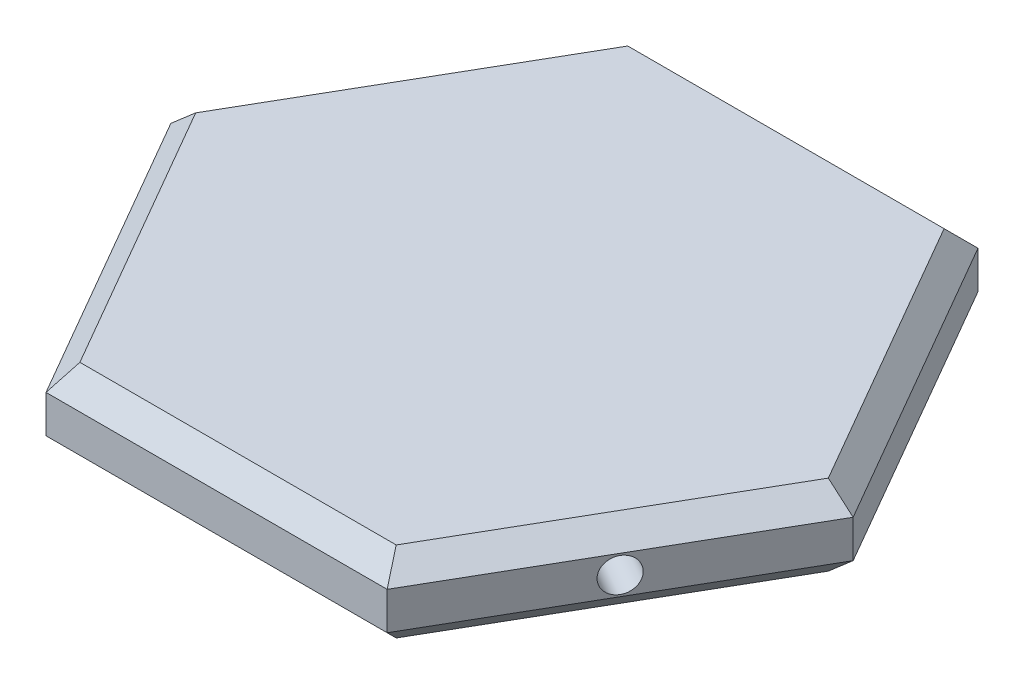
ISO-10303-21;
HEADER;
FILE_DESCRIPTION(('STEP AP214'),'2;1');
FILE_NAME('part.step','',(''),(''),'','','');
FILE_SCHEMA(('AUTOMOTIVE_DESIGN { 1 0 10303 214 1 1 1 1 }'));
ENDSEC;
DATA;
#1=APPLICATION_CONTEXT('core data for automotive mechanical design processes');
#2=APPLICATION_PROTOCOL_DEFINITION('international standard','automotive_design',2000,#1);
#3=PRODUCT_CONTEXT('',#1,'mechanical');
#4=PRODUCT('Part','Part','',(#3));
#5=PRODUCT_RELATED_PRODUCT_CATEGORY('part','',(#4));
#6=PRODUCT_DEFINITION_FORMATION('','',#4);
#7=PRODUCT_DEFINITION_CONTEXT('part definition',#1,'design');
#8=PRODUCT_DEFINITION('design','',#6,#7);
#9=PRODUCT_DEFINITION_SHAPE('','',#8);
#10=(LENGTH_UNIT() NAMED_UNIT(*) SI_UNIT(.MILLI.,.METRE.));
#11=(NAMED_UNIT(*) PLANE_ANGLE_UNIT() SI_UNIT($,.RADIAN.));
#12=(NAMED_UNIT(*) SI_UNIT($,.STERADIAN.) SOLID_ANGLE_UNIT());
#13=UNCERTAINTY_MEASURE_WITH_UNIT(LENGTH_MEASURE(1.E-05),#10,'distance_accuracy_value','');
#14=(GEOMETRIC_REPRESENTATION_CONTEXT(3) GLOBAL_UNCERTAINTY_ASSIGNED_CONTEXT((#13)) GLOBAL_UNIT_ASSIGNED_CONTEXT((#10,
#11,#12)) REPRESENTATION_CONTEXT('',''));
#15=CARTESIAN_POINT('',(0.,0.,0.));
#16=DIRECTION('',(0.,0.,1.));
#17=DIRECTION('',(1.,0.,0.));
#18=AXIS2_PLACEMENT_3D('',#15,#16,#17);
#19=CARTESIAN_POINT('',(-40.3279163028954,19.05,69.85));
#20=DIRECTION('',(0.,0.,-1.));
#21=DIRECTION('',(-1.,0.,0.));
#22=AXIS2_PLACEMENT_3D('',#19,#20,#21);
#23=PLANE('',#22);
#24=DIRECTION('',(0.,-1.,0.));
#25=VECTOR('',#24,1.);
#26=CARTESIAN_POINT('',(-40.3279163028954,19.05,69.85));
#27=LINE('',#26,#25);
#28=CARTESIAN_POINT('',(-40.3279163028954,13.97,69.85));
#29=VERTEX_POINT('',#28);
#30=CARTESIAN_POINT('',(-40.3279163028954,5.08000000000003,69.85));
#31=VERTEX_POINT('',#30);
#32=EDGE_CURVE('E147',#29,#31,#27,.T.);
#33=ORIENTED_EDGE('',*,*,#32,.T.);
#34=DIRECTION('',(1.,0.,0.));
#35=VECTOR('',#34,1.);
#36=CARTESIAN_POINT('',(-40.3279163028954,5.08000000000003,69.85));
#37=LINE('',#36,#35);
#38=CARTESIAN_POINT('',(40.3279163028954,5.08000000000003,69.85));
#39=VERTEX_POINT('',#38);
#40=EDGE_CURVE('E155',#31,#39,#37,.T.);
#41=ORIENTED_EDGE('',*,*,#40,.T.);
#42=DIRECTION('',(0.,-1.,0.));
#43=VECTOR('',#42,1.);
#44=CARTESIAN_POINT('',(40.3279163028954,19.05,69.85));
#45=LINE('',#44,#43);
#46=CARTESIAN_POINT('',(40.3279163028954,13.97,69.85));
#47=VERTEX_POINT('',#46);
#48=EDGE_CURVE('E149',#47,#39,#45,.T.);
#49=ORIENTED_EDGE('',*,*,#48,.F.);
#50=DIRECTION('',(-1.,0.,0.));
#51=VECTOR('',#50,1.);
#52=CARTESIAN_POINT('',(-40.3279163028954,13.97,69.85));
#53=LINE('',#52,#51);
#54=EDGE_CURVE('E145',#47,#29,#53,.T.);
#55=ORIENTED_EDGE('',*,*,#54,.T.);
#56=EDGE_LOOP('',(#33,#41,#49,#55));
#57=FACE_BOUND('',#56,.T.);
#58=ADVANCED_FACE('F53',(#57),#23,.F.);
#59=CARTESIAN_POINT('',(40.3279163028954,19.05,69.85));
#60=DIRECTION('',(-0.866025403784439,0.,-0.5));
#61=DIRECTION('',(-0.5,0.,0.866025403784439));
#62=AXIS2_PLACEMENT_3D('',#59,#60,#61);
#63=PLANE('',#62);
#64=CARTESIAN_POINT('',(60.4918744543432,9.52499999999996,34.9249999999997));
#65=DIRECTION('',(0.866025403784441,0.,0.499999999999996));
#66=DIRECTION('',(0.499999999999996,0.,-0.866025403784441));
#67=AXIS2_PLACEMENT_3D('',#64,#65,#66);
#68=CIRCLE('',#67,4.);
#69=CARTESIAN_POINT('',(62.4918744543432,9.52499999999996,31.460898384862));
#70=VERTEX_POINT('',#69);
#71=EDGE_CURVE('E697',#70,#70,#68,.T.);
#72=ORIENTED_EDGE('',*,*,#71,.F.);
#73=EDGE_LOOP('',(#72));
#74=FACE_BOUND('',#73,.T.);
#75=ORIENTED_EDGE('',*,*,#48,.T.);
#76=DIRECTION('',(0.5,0.,-0.866025403784439));
#77=VECTOR('',#76,1.);
#78=CARTESIAN_POINT('',(40.3279163028954,5.08000000000003,69.85));
#79=LINE('',#78,#77);
#80=CARTESIAN_POINT('',(80.6558326057907,5.08000000000004,0.));
#81=VERTEX_POINT('',#80);
#82=EDGE_CURVE('E156',#39,#81,#79,.T.);
#83=ORIENTED_EDGE('',*,*,#82,.T.);
#84=DIRECTION('',(0.,-1.,0.));
#85=VECTOR('',#84,1.);
#86=CARTESIAN_POINT('',(80.6558326057907,19.05,0.));
#87=LINE('',#86,#85);
#88=CARTESIAN_POINT('',(80.6558326057907,13.97,0.));
#89=VERTEX_POINT('',#88);
#90=EDGE_CURVE('E318',#89,#81,#87,.T.);
#91=ORIENTED_EDGE('',*,*,#90,.F.);
#92=DIRECTION('',(-0.5,0.,0.866025403784439));
#93=VECTOR('',#92,1.);
#94=CARTESIAN_POINT('',(40.3279163028954,13.97,69.85));
#95=LINE('',#94,#93);
#96=EDGE_CURVE('E289',#89,#47,#95,.T.);
#97=ORIENTED_EDGE('',*,*,#96,.T.);
#98=EDGE_LOOP('',(#75,#83,#91,#97));
#99=FACE_BOUND('',#98,.T.);
#100=ADVANCED_FACE('F316',(#74,#99),#63,.F.);
#101=CARTESIAN_POINT('',(80.6558326057907,19.05,0.));
#102=DIRECTION('',(-0.866025403784438,0.,0.5));
#103=DIRECTION('',(0.5,0.,0.866025403784438));
#104=AXIS2_PLACEMENT_3D('',#101,#102,#103);
#105=PLANE('',#104);
#106=ORIENTED_EDGE('',*,*,#90,.T.);
#107=DIRECTION('',(-0.5,0.,-0.866025403784438));
#108=VECTOR('',#107,1.);
#109=CARTESIAN_POINT('',(80.6558326057907,5.08000000000004,0.));
#110=LINE('',#109,#108);
#111=CARTESIAN_POINT('',(40.3279163028953,5.08000000000004,-69.85));
#112=VERTEX_POINT('',#111);
#113=EDGE_CURVE('E253',#81,#112,#110,.T.);
#114=ORIENTED_EDGE('',*,*,#113,.T.);
#115=DIRECTION('',(0.,-1.,0.));
#116=VECTOR('',#115,1.);
#117=CARTESIAN_POINT('',(40.3279163028953,19.05,-69.85));
#118=LINE('',#117,#116);
#119=CARTESIAN_POINT('',(40.3279163028953,13.97,-69.85));
#120=VERTEX_POINT('',#119);
#121=EDGE_CURVE('E321',#120,#112,#118,.T.);
#122=ORIENTED_EDGE('',*,*,#121,.F.);
#123=DIRECTION('',(0.5,0.,0.866025403784438));
#124=VECTOR('',#123,1.);
#125=CARTESIAN_POINT('',(80.6558326057907,13.97,0.));
#126=LINE('',#125,#124);
#127=EDGE_CURVE('E284',#120,#89,#126,.T.);
#128=ORIENTED_EDGE('',*,*,#127,.T.);
#129=EDGE_LOOP('',(#106,#114,#122,#128));
#130=FACE_BOUND('',#129,.T.);
#131=ADVANCED_FACE('F359',(#130),#105,.F.);
#132=CARTESIAN_POINT('',(40.3279163028953,19.05,-69.85));
#133=DIRECTION('',(0.,0.,1.));
#134=DIRECTION('',(1.,0.,0.));
#135=AXIS2_PLACEMENT_3D('',#132,#133,#134);
#136=PLANE('',#135);
#137=CARTESIAN_POINT('',(-6.55725473919233E-13,9.52499999999996,-69.85));
#138=DIRECTION('',(0.,0.,-1.));
#139=DIRECTION('',(-1.,0.,0.));
#140=AXIS2_PLACEMENT_3D('',#137,#138,#139);
#141=CIRCLE('',#140,4.);
#142=CARTESIAN_POINT('',(-4.00000000000065,9.52499999999996,-69.85));
#143=VERTEX_POINT('',#142);
#144=EDGE_CURVE('E689',#143,#143,#141,.T.);
#145=ORIENTED_EDGE('',*,*,#144,.F.);
#146=EDGE_LOOP('',(#145));
#147=FACE_BOUND('',#146,.T.);
#148=ORIENTED_EDGE('',*,*,#121,.T.);
#149=DIRECTION('',(-1.,0.,0.));
#150=VECTOR('',#149,1.);
#151=CARTESIAN_POINT('',(40.3279163028953,5.08000000000003,-69.85));
#152=LINE('',#151,#150);
#153=CARTESIAN_POINT('',(-40.3279163028954,5.08000000000003,-69.85));
#154=VERTEX_POINT('',#153);
#155=EDGE_CURVE('E248',#112,#154,#152,.T.);
#156=ORIENTED_EDGE('',*,*,#155,.T.);
#157=DIRECTION('',(0.,-1.,0.));
#158=VECTOR('',#157,1.);
#159=CARTESIAN_POINT('',(-40.3279163028954,19.05,-69.85));
#160=LINE('',#159,#158);
#161=CARTESIAN_POINT('',(-40.3279163028954,13.97,-69.85));
#162=VERTEX_POINT('',#161);
#163=EDGE_CURVE('E327',#162,#154,#160,.T.);
#164=ORIENTED_EDGE('',*,*,#163,.F.);
#165=DIRECTION('',(1.,0.,0.));
#166=VECTOR('',#165,1.);
#167=CARTESIAN_POINT('',(40.3279163028953,13.97,-69.85));
#168=LINE('',#167,#166);
#169=EDGE_CURVE('E279',#162,#120,#168,.T.);
#170=ORIENTED_EDGE('',*,*,#169,.T.);
#171=EDGE_LOOP('',(#148,#156,#164,#170));
#172=FACE_BOUND('',#171,.T.);
#173=ADVANCED_FACE('F597',(#147,#172),#136,.F.);
#174=CARTESIAN_POINT('',(-40.3279163028954,19.05,-69.85));
#175=DIRECTION('',(0.866025403784439,0.,0.5));
#176=DIRECTION('',(0.5,0.,-0.866025403784439));
#177=AXIS2_PLACEMENT_3D('',#174,#175,#176);
#178=PLANE('',#177);
#179=ORIENTED_EDGE('',*,*,#163,.T.);
#180=DIRECTION('',(-0.5,0.,0.866025403784439));
#181=VECTOR('',#180,1.);
#182=CARTESIAN_POINT('',(-40.3279163028954,5.08000000000003,-69.85));
#183=LINE('',#182,#181);
#184=CARTESIAN_POINT('',(-80.6558326057907,5.08000000000003,0.));
#185=VERTEX_POINT('',#184);
#186=EDGE_CURVE('E276',#154,#185,#183,.T.);
#187=ORIENTED_EDGE('',*,*,#186,.T.);
#188=DIRECTION('',(0.,-1.,0.));
#189=VECTOR('',#188,1.);
#190=CARTESIAN_POINT('',(-80.6558326057907,19.05,0.));
#191=LINE('',#190,#189);
#192=CARTESIAN_POINT('',(-80.6558326057907,13.97,0.));
#193=VERTEX_POINT('',#192);
#194=EDGE_CURVE('E169',#193,#185,#191,.T.);
#195=ORIENTED_EDGE('',*,*,#194,.F.);
#196=DIRECTION('',(0.5,0.,-0.866025403784439));
#197=VECTOR('',#196,1.);
#198=CARTESIAN_POINT('',(-40.3279163028954,13.97,-69.85));
#199=LINE('',#198,#197);
#200=EDGE_CURVE('E273',#193,#162,#199,.T.);
#201=ORIENTED_EDGE('',*,*,#200,.T.);
#202=EDGE_LOOP('',(#179,#187,#195,#201));
#203=FACE_BOUND('',#202,.T.);
#204=ADVANCED_FACE('F473',(#203),#178,.F.);
#205=CARTESIAN_POINT('',(-80.6558326057907,19.05,0.));
#206=DIRECTION('',(0.866025403784439,0.,-0.5));
#207=DIRECTION('',(-0.5,0.,-0.866025403784439));
#208=AXIS2_PLACEMENT_3D('',#205,#206,#207);
#209=PLANE('',#208);
#210=CARTESIAN_POINT('',(-60.491874454343,9.52499999999996,34.925));
#211=DIRECTION('',(-0.866025403784439,0.,0.5));
#212=DIRECTION('',(0.5,0.,0.866025403784439));
#213=AXIS2_PLACEMENT_3D('',#210,#211,#212);
#214=CIRCLE('',#213,4.);
#215=CARTESIAN_POINT('',(-58.491874454343,9.52499999999996,38.3891016151378));
#216=VERTEX_POINT('',#215);
#217=EDGE_CURVE('E191',#216,#216,#214,.T.);
#218=ORIENTED_EDGE('',*,*,#217,.F.);
#219=EDGE_LOOP('',(#218));
#220=FACE_BOUND('',#219,.T.);
#221=ORIENTED_EDGE('',*,*,#194,.T.);
#222=DIRECTION('',(0.5,0.,0.866025403784439));
#223=VECTOR('',#222,1.);
#224=CARTESIAN_POINT('',(-80.6558326057907,5.08000000000003,0.));
#225=LINE('',#224,#223);
#226=EDGE_CURVE('E167',#185,#31,#225,.T.);
#227=ORIENTED_EDGE('',*,*,#226,.T.);
#228=ORIENTED_EDGE('',*,*,#32,.F.);
#229=DIRECTION('',(-0.5,0.,-0.866025403784439));
#230=VECTOR('',#229,1.);
#231=CARTESIAN_POINT('',(-80.6558326057907,13.97,0.));
#232=LINE('',#231,#230);
#233=EDGE_CURVE('E164',#29,#193,#232,.T.);
#234=ORIENTED_EDGE('',*,*,#233,.T.);
#235=EDGE_LOOP('',(#221,#227,#228,#234));
#236=FACE_BOUND('',#235,.T.);
#237=ADVANCED_FACE('F163',(#220,#236),#209,.F.);
#238=CARTESIAN_POINT('',(0.,19.05,0.));
#239=DIRECTION('',(0.,1.,0.));
#240=DIRECTION('',(0.,0.,1.));
#241=AXIS2_PLACEMENT_3D('',#238,#239,#240);
#242=PLANE('',#241);
#243=DIRECTION('',(-0.5,0.,0.866025403784439));
#244=VECTOR('',#243,1.);
#245=CARTESIAN_POINT('',(-76.2564235545658,19.05,2.53999999999998));
#246=LINE('',#245,#244);
#247=CARTESIAN_POINT('',(-37.3949769354121,19.05,-64.7700000000001));
#248=VERTEX_POINT('',#247);
#249=CARTESIAN_POINT('',(-74.7899538708242,19.05,0.));
#250=VERTEX_POINT('',#249);
#251=EDGE_CURVE('E64',#248,#250,#246,.T.);
#252=ORIENTED_EDGE('',*,*,#251,.T.);
#253=DIRECTION('',(0.5,0.,0.866025403784439));
#254=VECTOR('',#253,1.);
#255=CARTESIAN_POINT('',(-35.9285072516704,19.05,67.31));
#256=LINE('',#255,#254);
#257=CARTESIAN_POINT('',(-37.3949769354121,19.05,64.77));
#258=VERTEX_POINT('',#257);
#259=EDGE_CURVE('E11',#250,#258,#256,.T.);
#260=ORIENTED_EDGE('',*,*,#259,.T.);
#261=DIRECTION('',(1.,0.,0.));
#262=VECTOR('',#261,1.);
#263=CARTESIAN_POINT('',(40.3279163028954,19.05,64.77));
#264=LINE('',#263,#262);
#265=CARTESIAN_POINT('',(37.394976935412,19.05,64.77));
#266=VERTEX_POINT('',#265);
#267=EDGE_CURVE('E182',#258,#266,#264,.T.);
#268=ORIENTED_EDGE('',*,*,#267,.T.);
#269=DIRECTION('',(0.5,0.,-0.866025403784439));
#270=VECTOR('',#269,1.);
#271=CARTESIAN_POINT('',(76.2564235545658,19.05,-2.54000000000003));
#272=LINE('',#271,#270);
#273=CARTESIAN_POINT('',(74.7899538708241,19.05,0.));
#274=VERTEX_POINT('',#273);
#275=EDGE_CURVE('E298',#266,#274,#272,.T.);
#276=ORIENTED_EDGE('',*,*,#275,.T.);
#277=DIRECTION('',(-0.5,0.,-0.866025403784439));
#278=VECTOR('',#277,1.);
#279=CARTESIAN_POINT('',(35.9285072516704,19.05,-67.31));
#280=LINE('',#279,#278);
#281=CARTESIAN_POINT('',(37.394976935412,19.05,-64.7700000000001));
#282=VERTEX_POINT('',#281);
#283=EDGE_CURVE('E301',#274,#282,#280,.T.);
#284=ORIENTED_EDGE('',*,*,#283,.T.);
#285=DIRECTION('',(-1.,0.,0.));
#286=VECTOR('',#285,1.);
#287=CARTESIAN_POINT('',(-40.3279163028954,19.05,-64.7700000000001));
#288=LINE('',#287,#286);
#289=EDGE_CURVE('E75',#282,#248,#288,.T.);
#290=ORIENTED_EDGE('',*,*,#289,.T.);
#291=EDGE_LOOP('',(#252,#260,#268,#276,#284,#290));
#292=FACE_BOUND('',#291,.T.);
#293=ADVANCED_FACE('F307',(#292),#242,.T.);
#294=CARTESIAN_POINT('',(0.,0.,0.));
#295=DIRECTION('',(0.,1.,0.));
#296=DIRECTION('',(0.,0.,1.));
#297=AXIS2_PLACEMENT_3D('',#294,#295,#296);
#298=PLANE('',#297);
#299=DIRECTION('',(-1.,0.,0.));
#300=VECTOR('',#299,1.);
#301=CARTESIAN_POINT('',(0.,0.,64.77));
#302=LINE('',#301,#300);
#303=CARTESIAN_POINT('',(37.394976935412,0.,64.77));
#304=VERTEX_POINT('',#303);
#305=CARTESIAN_POINT('',(-37.394976935412,0.,64.77));
#306=VERTEX_POINT('',#305);
#307=EDGE_CURVE('E263',#304,#306,#302,.T.);
#308=ORIENTED_EDGE('',*,*,#307,.T.);
#309=DIRECTION('',(-0.5,0.,-0.866025403784439));
#310=VECTOR('',#309,1.);
#311=CARTESIAN_POINT('',(-56.0924654031181,0.,32.385));
#312=LINE('',#311,#310);
#313=CARTESIAN_POINT('',(-74.7899538708241,0.,0.));
#314=VERTEX_POINT('',#313);
#315=EDGE_CURVE('E269',#306,#314,#312,.T.);
#316=ORIENTED_EDGE('',*,*,#315,.T.);
#317=DIRECTION('',(0.5,0.,-0.866025403784439));
#318=VECTOR('',#317,1.);
#319=CARTESIAN_POINT('',(-56.0924654031181,0.,-32.385));
#320=LINE('',#319,#318);
#321=CARTESIAN_POINT('',(-37.3949769354121,0.,-64.77));
#322=VERTEX_POINT('',#321);
#323=EDGE_CURVE('E261',#314,#322,#320,.T.);
#324=ORIENTED_EDGE('',*,*,#323,.T.);
#325=DIRECTION('',(1.,0.,0.));
#326=VECTOR('',#325,1.);
#327=CARTESIAN_POINT('',(0.,0.,-64.77));
#328=LINE('',#327,#326);
#329=CARTESIAN_POINT('',(37.394976935412,0.,-64.77));
#330=VERTEX_POINT('',#329);
#331=EDGE_CURVE('E247',#322,#330,#328,.T.);
#332=ORIENTED_EDGE('',*,*,#331,.T.);
#333=DIRECTION('',(0.5,0.,0.866025403784439));
#334=VECTOR('',#333,1.);
#335=CARTESIAN_POINT('',(56.092465403118,0.,-32.385));
#336=LINE('',#335,#334);
#337=CARTESIAN_POINT('',(74.7899538708241,0.,0.));
#338=VERTEX_POINT('',#337);
#339=EDGE_CURVE('E254',#330,#338,#336,.T.);
#340=ORIENTED_EDGE('',*,*,#339,.T.);
#341=DIRECTION('',(-0.5,0.,0.866025403784439));
#342=VECTOR('',#341,1.);
#343=CARTESIAN_POINT('',(56.092465403118,0.,32.3849999999999));
#344=LINE('',#343,#342);
#345=EDGE_CURVE('E257',#338,#304,#344,.T.);
#346=ORIENTED_EDGE('',*,*,#345,.T.);
#347=EDGE_LOOP('',(#308,#316,#324,#332,#340,#346));
#348=FACE_BOUND('',#347,.T.);
#349=ADVANCED_FACE('F334',(#348),#298,.F.);
#350=CARTESIAN_POINT('',(80.6558326057907,5.08000000000003,0.));
#351=DIRECTION('',(-0.612372435695794,0.707106781186548,0.353553390593274));
#352=DIRECTION('',(-0.5,0.,-0.866025403784438));
#353=AXIS2_PLACEMENT_3D('',#350,#351,#352);
#354=PLANE('',#353);
#355=DIRECTION('',(0.755928946018455,0.654653670707976,0.));
#356=VECTOR('',#355,1.);
#357=CARTESIAN_POINT('',(57.6113090041362,-14.8771428571427,0.));
#358=LINE('',#357,#356);
#359=EDGE_CURVE('E232',#338,#81,#358,.T.);
#360=ORIENTED_EDGE('',*,*,#359,.F.);
#361=ORIENTED_EDGE('',*,*,#339,.F.);
#362=DIRECTION('',(0.37796447300923,0.654653670707978,-0.654653670707975));
#363=VECTOR('',#362,1.);
#364=CARTESIAN_POINT('',(28.8056545020681,-14.8771428571427,-49.8928571428574));
#365=LINE('',#364,#363);
#366=EDGE_CURVE('E170',#112,#330,#365,.F.);
#367=ORIENTED_EDGE('',*,*,#366,.F.);
#368=ORIENTED_EDGE('',*,*,#113,.F.);
#369=EDGE_LOOP('',(#360,#361,#367,#368));
#370=FACE_BOUND('',#369,.T.);
#371=ADVANCED_FACE('F252',(#370),#354,.F.);
#372=CARTESIAN_POINT('',(40.3279163028953,5.08000000000003,-69.85));
#373=DIRECTION('',(0.,0.707106781186546,0.707106781186549));
#374=DIRECTION('',(-1.,0.,0.));
#375=AXIS2_PLACEMENT_3D('',#372,#373,#374);
#376=PLANE('',#375);
#377=ORIENTED_EDGE('',*,*,#366,.T.);
#378=ORIENTED_EDGE('',*,*,#331,.F.);
#379=DIRECTION('',(-0.377964473009229,0.654653670707978,-0.654653670707975));
#380=VECTOR('',#379,1.);
#381=CARTESIAN_POINT('',(-28.8056545020681,-14.8771428571429,-49.8928571428572));
#382=LINE('',#381,#380);
#383=EDGE_CURVE('E229',#154,#322,#382,.F.);
#384=ORIENTED_EDGE('',*,*,#383,.F.);
#385=ORIENTED_EDGE('',*,*,#155,.F.);
#386=EDGE_LOOP('',(#377,#378,#384,#385));
#387=FACE_BOUND('',#386,.T.);
#388=ADVANCED_FACE('F245',(#387),#376,.F.);
#389=CARTESIAN_POINT('',(40.3279163028954,5.08000000000003,69.85));
#390=DIRECTION('',(-0.612372435695793,0.707106781186549,-0.353553390593273));
#391=DIRECTION('',(0.5,0.,-0.866025403784439));
#392=AXIS2_PLACEMENT_3D('',#389,#390,#391);
#393=PLANE('',#392);
#394=ORIENTED_EDGE('',*,*,#359,.T.);
#395=ORIENTED_EDGE('',*,*,#82,.F.);
#396=DIRECTION('',(0.37796447300923,0.654653670707976,0.654653670707976));
#397=VECTOR('',#396,1.);
#398=CARTESIAN_POINT('',(28.8056545020679,-14.877142857143,49.892857142857));
#399=LINE('',#398,#397);
#400=EDGE_CURVE('E222',#304,#39,#399,.T.);
#401=ORIENTED_EDGE('',*,*,#400,.F.);
#402=ORIENTED_EDGE('',*,*,#345,.F.);
#403=EDGE_LOOP('',(#394,#395,#401,#402));
#404=FACE_BOUND('',#403,.T.);
#405=ADVANCED_FACE('F341',(#404),#393,.F.);
#406=CARTESIAN_POINT('',(-40.3279163028954,5.08000000000003,-69.85));
#407=DIRECTION('',(0.612372435695795,0.707106781186547,0.353553390593274));
#408=DIRECTION('',(-0.5,0.,0.866025403784439));
#409=AXIS2_PLACEMENT_3D('',#406,#407,#408);
#410=PLANE('',#409);
#411=ORIENTED_EDGE('',*,*,#383,.T.);
#412=ORIENTED_EDGE('',*,*,#323,.F.);
#413=DIRECTION('',(-0.755928946018454,0.654653670707977,0.));
#414=VECTOR('',#413,1.);
#415=CARTESIAN_POINT('',(-57.6113090041362,-14.8771428571429,0.));
#416=LINE('',#415,#414);
#417=EDGE_CURVE('E215',#185,#314,#416,.F.);
#418=ORIENTED_EDGE('',*,*,#417,.F.);
#419=ORIENTED_EDGE('',*,*,#186,.F.);
#420=EDGE_LOOP('',(#411,#412,#418,#419));
#421=FACE_BOUND('',#420,.T.);
#422=ADVANCED_FACE('F343',(#421),#410,.F.);
#423=CARTESIAN_POINT('',(-40.3279163028954,5.08000000000003,69.85));
#424=DIRECTION('',(0.,0.707106781186547,-0.707106781186547));
#425=DIRECTION('',(1.,0.,0.));
#426=AXIS2_PLACEMENT_3D('',#423,#424,#425);
#427=PLANE('',#426);
#428=ORIENTED_EDGE('',*,*,#400,.T.);
#429=ORIENTED_EDGE('',*,*,#40,.F.);
#430=DIRECTION('',(0.377964473009227,-0.654653670707977,-0.654653670707977));
#431=VECTOR('',#430,1.);
#432=CARTESIAN_POINT('',(-40.3279163028954,5.08000000000003,69.85));
#433=LINE('',#432,#431);
#434=EDGE_CURVE('E210',#306,#31,#433,.F.);
#435=ORIENTED_EDGE('',*,*,#434,.F.);
#436=ORIENTED_EDGE('',*,*,#307,.F.);
#437=EDGE_LOOP('',(#428,#429,#435,#436));
#438=FACE_BOUND('',#437,.T.);
#439=ADVANCED_FACE('F340',(#438),#427,.F.);
#440=CARTESIAN_POINT('',(-80.6558326057907,5.08000000000003,0.));
#441=DIRECTION('',(0.612372435695794,0.707106781186547,-0.353553390593274));
#442=DIRECTION('',(0.5,0.,0.866025403784439));
#443=AXIS2_PLACEMENT_3D('',#440,#441,#442);
#444=PLANE('',#443);
#445=ORIENTED_EDGE('',*,*,#417,.T.);
#446=ORIENTED_EDGE('',*,*,#315,.F.);
#447=ORIENTED_EDGE('',*,*,#434,.T.);
#448=ORIENTED_EDGE('',*,*,#226,.F.);
#449=EDGE_LOOP('',(#445,#446,#447,#448));
#450=FACE_BOUND('',#449,.T.);
#451=ADVANCED_FACE('F337',(#450),#444,.F.);
#452=CARTESIAN_POINT('',(56.0924654031181,19.05,-32.385));
#453=DIRECTION('',(0.612372435695797,0.707106781186545,-0.353553390593275));
#454=DIRECTION('',(0.5,0.,0.866025403784438));
#455=AXIS2_PLACEMENT_3D('',#452,#453,#454);
#456=PLANE('',#455);
#457=DIRECTION('',(-0.755928946018453,0.654653670707979,0.));
#458=VECTOR('',#457,1.);
#459=CARTESIAN_POINT('',(64.1056747464208,28.3028571428571,-1.11022302462516E-13));
#460=LINE('',#459,#458);
#461=EDGE_CURVE('E201',#89,#274,#460,.T.);
#462=ORIENTED_EDGE('',*,*,#461,.F.);
#463=ORIENTED_EDGE('',*,*,#127,.F.);
#464=DIRECTION('',(-0.377964473009227,0.65465367070798,0.654653670707974));
#465=VECTOR('',#464,1.);
#466=CARTESIAN_POINT('',(32.0528373732103,28.3028571428571,-55.517142857143));
#467=LINE('',#466,#465);
#468=EDGE_CURVE('E58',#282,#120,#467,.F.);
#469=ORIENTED_EDGE('',*,*,#468,.F.);
#470=ORIENTED_EDGE('',*,*,#283,.F.);
#471=EDGE_LOOP('',(#462,#463,#469,#470));
#472=FACE_BOUND('',#471,.T.);
#473=ADVANCED_FACE('F56',(#472),#456,.T.);
#474=CARTESIAN_POINT('',(0.,19.05,-64.7700000000001));
#475=DIRECTION('',(0.,0.707106781186544,-0.707106781186551));
#476=DIRECTION('',(1.,0.,0.));
#477=AXIS2_PLACEMENT_3D('',#474,#475,#476);
#478=PLANE('',#477);
#479=ORIENTED_EDGE('',*,*,#468,.T.);
#480=ORIENTED_EDGE('',*,*,#169,.F.);
#481=DIRECTION('',(0.377964473009228,0.65465367070798,0.654653670707974));
#482=VECTOR('',#481,1.);
#483=CARTESIAN_POINT('',(-32.0528373732104,28.3028571428572,-55.517142857143));
#484=LINE('',#483,#482);
#485=EDGE_CURVE('E198',#248,#162,#484,.F.);
#486=ORIENTED_EDGE('',*,*,#485,.F.);
#487=ORIENTED_EDGE('',*,*,#289,.F.);
#488=EDGE_LOOP('',(#479,#480,#486,#487));
#489=FACE_BOUND('',#488,.T.);
#490=ADVANCED_FACE('F310',(#489),#478,.T.);
#491=CARTESIAN_POINT('',(56.0924654031181,19.05,32.385));
#492=DIRECTION('',(0.612372435695795,0.707106781186547,0.353553390593274));
#493=DIRECTION('',(-0.5,0.,0.866025403784439));
#494=AXIS2_PLACEMENT_3D('',#491,#492,#493);
#495=PLANE('',#494);
#496=ORIENTED_EDGE('',*,*,#461,.T.);
#497=ORIENTED_EDGE('',*,*,#275,.F.);
#498=DIRECTION('',(-0.377964473009229,0.654653670707978,-0.654653670707975));
#499=VECTOR('',#498,1.);
#500=CARTESIAN_POINT('',(32.0528373732103,28.3028571428572,55.5171428571429));
#501=LINE('',#500,#499);
#502=EDGE_CURVE('E188',#47,#266,#501,.T.);
#503=ORIENTED_EDGE('',*,*,#502,.F.);
#504=ORIENTED_EDGE('',*,*,#96,.F.);
#505=EDGE_LOOP('',(#496,#497,#503,#504));
#506=FACE_BOUND('',#505,.T.);
#507=ADVANCED_FACE('F313',(#506),#495,.T.);
#508=CARTESIAN_POINT('',(-56.0924654031181,19.05,-32.385));
#509=DIRECTION('',(-0.612372435695797,0.707106781186545,-0.353553390593275));
#510=DIRECTION('',(0.5,0.,-0.866025403784439));
#511=AXIS2_PLACEMENT_3D('',#508,#509,#510);
#512=PLANE('',#511);
#513=ORIENTED_EDGE('',*,*,#485,.T.);
#514=ORIENTED_EDGE('',*,*,#200,.F.);
#515=DIRECTION('',(0.755928946018452,0.654653670707979,0.));
#516=VECTOR('',#515,1.);
#517=CARTESIAN_POINT('',(-64.1056747464208,28.3028571428572,0.));
#518=LINE('',#517,#516);
#519=EDGE_CURVE('E177',#250,#193,#518,.F.);
#520=ORIENTED_EDGE('',*,*,#519,.F.);
#521=ORIENTED_EDGE('',*,*,#251,.F.);
#522=EDGE_LOOP('',(#513,#514,#520,#521));
#523=FACE_BOUND('',#522,.T.);
#524=ADVANCED_FACE('F312',(#523),#512,.T.);
#525=CARTESIAN_POINT('',(0.,19.05,64.77));
#526=DIRECTION('',(0.,0.707106781186546,0.707106781186549));
#527=DIRECTION('',(-1.,0.,0.));
#528=AXIS2_PLACEMENT_3D('',#525,#526,#527);
#529=PLANE('',#528);
#530=ORIENTED_EDGE('',*,*,#502,.T.);
#531=ORIENTED_EDGE('',*,*,#267,.F.);
#532=DIRECTION('',(-0.377964473009226,-0.654653670707979,0.654653670707976));
#533=VECTOR('',#532,1.);
#534=CARTESIAN_POINT('',(-32.0528373732104,28.3028571428572,55.5171428571429));
#535=LINE('',#534,#533);
#536=EDGE_CURVE('E175',#29,#258,#535,.F.);
#537=ORIENTED_EDGE('',*,*,#536,.F.);
#538=ORIENTED_EDGE('',*,*,#54,.F.);
#539=EDGE_LOOP('',(#530,#531,#537,#538));
#540=FACE_BOUND('',#539,.T.);
#541=ADVANCED_FACE('F181',(#540),#529,.T.);
#542=CARTESIAN_POINT('',(-56.0924654031181,19.05,32.385));
#543=DIRECTION('',(-0.612372435695796,0.707106781186546,0.353553390593275));
#544=DIRECTION('',(-0.5,0.,-0.866025403784439));
#545=AXIS2_PLACEMENT_3D('',#542,#543,#544);
#546=PLANE('',#545);
#547=ORIENTED_EDGE('',*,*,#519,.T.);
#548=ORIENTED_EDGE('',*,*,#233,.F.);
#549=ORIENTED_EDGE('',*,*,#536,.T.);
#550=ORIENTED_EDGE('',*,*,#259,.F.);
#551=EDGE_LOOP('',(#547,#548,#549,#550));
#552=FACE_BOUND('',#551,.T.);
#553=ADVANCED_FACE('F173',(#552),#546,.T.);
#554=CARTESIAN_POINT('',(-49.4933518262807,9.52499999999996,28.575));
#555=DIRECTION('',(-0.866025403784439,0.,0.5));
#556=DIRECTION('',(0.5,0.,0.866025403784439));
#557=AXIS2_PLACEMENT_3D('',#554,#555,#556);
#558=CYLINDRICAL_SURFACE('',#557,4.);
#559=CARTESIAN_POINT('',(-49.4933518262807,9.52499999999996,28.575));
#560=DIRECTION('',(-0.866025403784439,0.,0.5));
#561=DIRECTION('',(0.5,0.,0.866025403784439));
#562=AXIS2_PLACEMENT_3D('',#559,#560,#561);
#563=CIRCLE('',#562,4.);
#564=CARTESIAN_POINT('',(-47.4933518262807,9.52499999999996,32.0391016151378));
#565=VERTEX_POINT('',#564);
#566=EDGE_CURVE('E184',#565,#565,#563,.T.);
#567=ORIENTED_EDGE('',*,*,#566,.F.);
#568=EDGE_LOOP('',(#567));
#569=FACE_BOUND('',#568,.T.);
#570=ORIENTED_EDGE('',*,*,#217,.T.);
#571=EDGE_LOOP('',(#570));
#572=FACE_BOUND('',#571,.T.);
#573=ADVANCED_FACE('F393',(#569,#572),#558,.F.);
#574=CARTESIAN_POINT('',(-49.4933518262807,9.52499999999996,28.575));
#575=DIRECTION('',(-0.866025403784439,0.,0.5));
#576=DIRECTION('',(0.5,0.,0.866025403784439));
#577=AXIS2_PLACEMENT_3D('',#574,#575,#576);
#578=PLANE('',#577);
#579=ORIENTED_EDGE('',*,*,#566,.T.);
#580=EDGE_LOOP('',(#579));
#581=FACE_BOUND('',#580,.T.);
#582=ADVANCED_FACE('F575',(#581),#578,.T.);
#583=CARTESIAN_POINT('',(-5.35876898410948E-13,9.52499999999996,-57.15));
#584=DIRECTION('',(0.,0.,-1.));
#585=DIRECTION('',(-1.,0.,0.));
#586=AXIS2_PLACEMENT_3D('',#583,#584,#585);
#587=CYLINDRICAL_SURFACE('',#586,4.);
#588=CARTESIAN_POINT('',(-5.35876898410948E-13,9.52499999999996,-57.15));
#589=DIRECTION('',(0.,0.,-1.));
#590=DIRECTION('',(-1.,0.,0.));
#591=AXIS2_PLACEMENT_3D('',#588,#589,#590);
#592=CIRCLE('',#591,4.);
#593=CARTESIAN_POINT('',(-4.00000000000053,9.52499999999996,-57.15));
#594=VERTEX_POINT('',#593);
#595=EDGE_CURVE('E693',#594,#594,#592,.T.);
#596=ORIENTED_EDGE('',*,*,#595,.F.);
#597=EDGE_LOOP('',(#596));
#598=FACE_BOUND('',#597,.T.);
#599=ORIENTED_EDGE('',*,*,#144,.T.);
#600=EDGE_LOOP('',(#599));
#601=FACE_BOUND('',#600,.T.);
#602=ADVANCED_FACE('F583',(#598,#601),#587,.F.);
#603=CARTESIAN_POINT('',(-5.35876898410948E-13,9.52499999999996,-57.15));
#604=DIRECTION('',(0.,0.,-1.));
#605=DIRECTION('',(-1.,0.,0.));
#606=AXIS2_PLACEMENT_3D('',#603,#604,#605);
#607=PLANE('',#606);
#608=ORIENTED_EDGE('',*,*,#595,.T.);
#609=EDGE_LOOP('',(#608));
#610=FACE_BOUND('',#609,.T.);
#611=ADVANCED_FACE('F608',(#610),#607,.T.);
#612=CARTESIAN_POINT('',(49.4933518262808,9.52499999999996,28.5749999999998));
#613=DIRECTION('',(0.866025403784441,0.,0.499999999999996));
#614=DIRECTION('',(0.499999999999996,0.,-0.866025403784441));
#615=AXIS2_PLACEMENT_3D('',#612,#613,#614);
#616=CYLINDRICAL_SURFACE('',#615,4.);
#617=CARTESIAN_POINT('',(49.4933518262808,9.52499999999996,28.5749999999998));
#618=DIRECTION('',(0.866025403784441,0.,0.499999999999996));
#619=DIRECTION('',(0.499999999999996,0.,-0.866025403784441));
#620=AXIS2_PLACEMENT_3D('',#617,#618,#619);
#621=CIRCLE('',#620,4.);
#622=CARTESIAN_POINT('',(51.4933518262808,9.52499999999996,25.110898384862));
#623=VERTEX_POINT('',#622);
#624=EDGE_CURVE('E687',#623,#623,#621,.T.);
#625=ORIENTED_EDGE('',*,*,#624,.F.);
#626=EDGE_LOOP('',(#625));
#627=FACE_BOUND('',#626,.T.);
#628=ORIENTED_EDGE('',*,*,#71,.T.);
#629=EDGE_LOOP('',(#628));
#630=FACE_BOUND('',#629,.T.);
#631=ADVANCED_FACE('F617',(#627,#630),#616,.F.);
#632=CARTESIAN_POINT('',(49.4933518262808,9.52499999999996,28.5749999999998));
#633=DIRECTION('',(0.866025403784441,0.,0.499999999999996));
#634=DIRECTION('',(0.499999999999996,0.,-0.866025403784441));
#635=AXIS2_PLACEMENT_3D('',#632,#633,#634);
#636=PLANE('',#635);
#637=ORIENTED_EDGE('',*,*,#624,.T.);
#638=EDGE_LOOP('',(#637));
#639=FACE_BOUND('',#638,.T.);
#640=ADVANCED_FACE('F626',(#639),#636,.T.);
#641=CLOSED_SHELL('',(#58,#100,#131,#173,#204,#237,#293,#349,#371,#388,#405,#422,#439,#451,#473,
#490,#507,#524,#541,#553,#573,#582,#602,#611,#631,#640));
#642=MANIFOLD_SOLID_BREP('B2',#641);
#643=ADVANCED_BREP_SHAPE_REPRESENTATION('',(#18,#642),#14);
#644=SHAPE_DEFINITION_REPRESENTATION(#9,#643);
ENDSEC;
END-ISO-10303-21;
